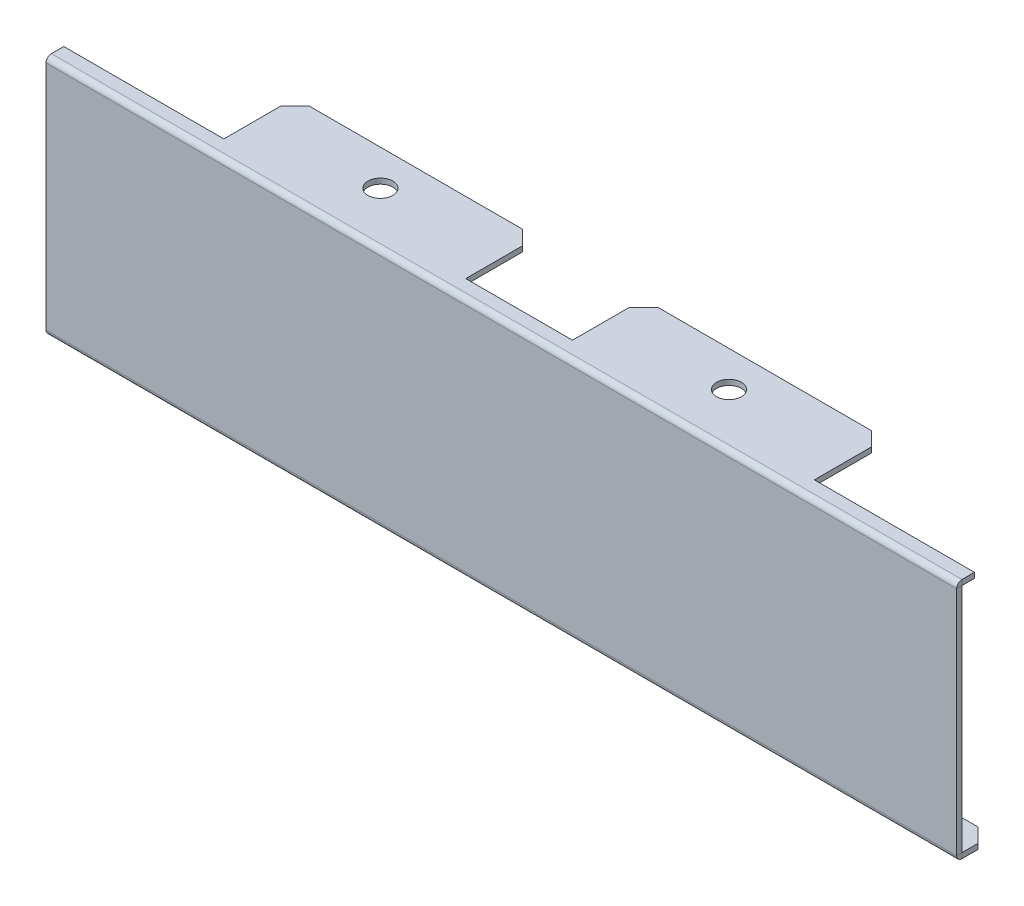
ISO-10303-21;
HEADER;
FILE_DESCRIPTION(('STEP AP214'),'2;1');
FILE_NAME('part.step','',(''),(''),'','','');
FILE_SCHEMA(('AUTOMOTIVE_DESIGN { 1 0 10303 214 1 1 1 1 }'));
ENDSEC;
DATA;
#1=APPLICATION_CONTEXT('core data for automotive mechanical design processes');
#2=APPLICATION_PROTOCOL_DEFINITION('international standard','automotive_design',2000,#1);
#3=PRODUCT_CONTEXT('',#1,'mechanical');
#4=PRODUCT('Part','Part','',(#3));
#5=PRODUCT_RELATED_PRODUCT_CATEGORY('part','',(#4));
#6=PRODUCT_DEFINITION_FORMATION('','',#4);
#7=PRODUCT_DEFINITION_CONTEXT('part definition',#1,'design');
#8=PRODUCT_DEFINITION('design','',#6,#7);
#9=PRODUCT_DEFINITION_SHAPE('','',#8);
#10=(LENGTH_UNIT() NAMED_UNIT(*) SI_UNIT(.MILLI.,.METRE.));
#11=(NAMED_UNIT(*) PLANE_ANGLE_UNIT() SI_UNIT($,.RADIAN.));
#12=(NAMED_UNIT(*) SI_UNIT($,.STERADIAN.) SOLID_ANGLE_UNIT());
#13=UNCERTAINTY_MEASURE_WITH_UNIT(LENGTH_MEASURE(1.E-05),#10,'distance_accuracy_value','');
#14=(GEOMETRIC_REPRESENTATION_CONTEXT(3) GLOBAL_UNCERTAINTY_ASSIGNED_CONTEXT((#13)) GLOBAL_UNIT_ASSIGNED_CONTEXT((#10,
#11,#12)) REPRESENTATION_CONTEXT('',''));
#15=CARTESIAN_POINT('',(0.,0.,0.));
#16=DIRECTION('',(0.,0.,1.));
#17=DIRECTION('',(1.,0.,0.));
#18=AXIS2_PLACEMENT_3D('',#15,#16,#17);
#19=CARTESIAN_POINT('',(0.,0.,-1.5));
#20=DIRECTION('',(0.,0.,1.));
#21=DIRECTION('',(1.,0.,0.));
#22=AXIS2_PLACEMENT_3D('',#19,#20,#21);
#23=PLANE('',#22);
#24=DIRECTION('',(1.,0.,0.));
#25=VECTOR('',#24,1.);
#26=CARTESIAN_POINT('',(-128.,-32.5,-1.5));
#27=LINE('',#26,#25);
#28=CARTESIAN_POINT('',(128.,-32.5,-1.5));
#29=VERTEX_POINT('',#28);
#30=CARTESIAN_POINT('',(-128.,-32.5,-1.5));
#31=VERTEX_POINT('',#30);
#32=EDGE_CURVE('E355',#29,#31,#27,.F.);
#33=ORIENTED_EDGE('',*,*,#32,.T.);
#34=DIRECTION('',(0.,-1.,0.));
#35=VECTOR('',#34,1.);
#36=CARTESIAN_POINT('',(-128.,34.,-1.5));
#37=LINE('',#36,#35);
#38=CARTESIAN_POINT('',(-128.,32.5,-1.5));
#39=VERTEX_POINT('',#38);
#40=EDGE_CURVE('E13',#39,#31,#37,.T.);
#41=ORIENTED_EDGE('',*,*,#40,.F.);
#42=DIRECTION('',(-1.,0.,0.));
#43=VECTOR('',#42,1.);
#44=CARTESIAN_POINT('',(128.,32.5,-1.5));
#45=LINE('',#44,#43);
#46=CARTESIAN_POINT('',(128.,32.5,-1.5));
#47=VERTEX_POINT('',#46);
#48=EDGE_CURVE('E455',#39,#47,#45,.F.);
#49=ORIENTED_EDGE('',*,*,#48,.T.);
#50=DIRECTION('',(0.,1.,0.));
#51=VECTOR('',#50,1.);
#52=CARTESIAN_POINT('',(128.,34.,-1.5));
#53=LINE('',#52,#51);
#54=EDGE_CURVE('E156',#29,#47,#53,.T.);
#55=ORIENTED_EDGE('',*,*,#54,.F.);
#56=EDGE_LOOP('',(#33,#41,#49,#55));
#57=FACE_BOUND('',#56,.T.);
#58=ADVANCED_FACE('F147',(#57),#23,.F.);
#59=CARTESIAN_POINT('',(0.,0.,0.));
#60=DIRECTION('',(0.,0.,1.));
#61=DIRECTION('',(1.,0.,0.));
#62=AXIS2_PLACEMENT_3D('',#59,#60,#61);
#63=PLANE('',#62);
#64=DIRECTION('',(0.,-1.,0.));
#65=VECTOR('',#64,1.);
#66=CARTESIAN_POINT('',(-128.,34.,0.));
#67=LINE('',#66,#65);
#68=CARTESIAN_POINT('',(-128.,32.5,0.));
#69=VERTEX_POINT('',#68);
#70=CARTESIAN_POINT('',(-128.,-32.5,0.));
#71=VERTEX_POINT('',#70);
#72=EDGE_CURVE('E500',#69,#71,#67,.T.);
#73=ORIENTED_EDGE('',*,*,#72,.T.);
#74=DIRECTION('',(-1.,0.,0.));
#75=VECTOR('',#74,1.);
#76=CARTESIAN_POINT('',(0.,-32.5,0.));
#77=LINE('',#76,#75);
#78=CARTESIAN_POINT('',(128.,-32.5,0.));
#79=VERTEX_POINT('',#78);
#80=EDGE_CURVE('E360',#79,#71,#77,.T.);
#81=ORIENTED_EDGE('',*,*,#80,.F.);
#82=DIRECTION('',(0.,1.,0.));
#83=VECTOR('',#82,1.);
#84=CARTESIAN_POINT('',(128.,34.,0.));
#85=LINE('',#84,#83);
#86=CARTESIAN_POINT('',(128.,32.5,0.));
#87=VERTEX_POINT('',#86);
#88=EDGE_CURVE('E171',#79,#87,#85,.T.);
#89=ORIENTED_EDGE('',*,*,#88,.T.);
#90=DIRECTION('',(1.,0.,0.));
#91=VECTOR('',#90,1.);
#92=CARTESIAN_POINT('',(0.,32.5,0.));
#93=LINE('',#92,#91);
#94=EDGE_CURVE('E491',#69,#87,#93,.T.);
#95=ORIENTED_EDGE('',*,*,#94,.F.);
#96=EDGE_LOOP('',(#73,#81,#89,#95));
#97=FACE_BOUND('',#96,.T.);
#98=ADVANCED_FACE('F562',(#97),#63,.T.);
#99=CARTESIAN_POINT('',(-128.,34.,-1.5));
#100=DIRECTION('',(-1.,0.,0.));
#101=DIRECTION('',(0.,0.,1.));
#102=AXIS2_PLACEMENT_3D('',#99,#100,#101);
#103=PLANE('',#102);
#104=ORIENTED_EDGE('',*,*,#40,.T.);
#105=DIRECTION('',(0.,0.,-1.));
#106=VECTOR('',#105,1.);
#107=CARTESIAN_POINT('',(-128.,-32.5,0.));
#108=LINE('',#107,#106);
#109=EDGE_CURVE('E163',#71,#31,#108,.T.);
#110=ORIENTED_EDGE('',*,*,#109,.F.);
#111=ORIENTED_EDGE('',*,*,#72,.F.);
#112=DIRECTION('',(0.,0.,-1.));
#113=VECTOR('',#112,1.);
#114=CARTESIAN_POINT('',(-128.,32.5,0.));
#115=LINE('',#114,#113);
#116=EDGE_CURVE('E494',#69,#39,#115,.T.);
#117=ORIENTED_EDGE('',*,*,#116,.T.);
#118=EDGE_LOOP('',(#104,#110,#111,#117));
#119=FACE_BOUND('',#118,.T.);
#120=ADVANCED_FACE('F567',(#119),#103,.T.);
#121=CARTESIAN_POINT('',(128.,34.,-1.5));
#122=DIRECTION('',(1.,0.,0.));
#123=DIRECTION('',(0.,1.,0.));
#124=AXIS2_PLACEMENT_3D('',#121,#122,#123);
#125=PLANE('',#124);
#126=DIRECTION('',(0.,0.,-1.));
#127=VECTOR('',#126,1.);
#128=CARTESIAN_POINT('',(128.,-32.5,0.));
#129=LINE('',#128,#127);
#130=EDGE_CURVE('E364',#79,#29,#129,.T.);
#131=ORIENTED_EDGE('',*,*,#130,.T.);
#132=ORIENTED_EDGE('',*,*,#54,.T.);
#133=DIRECTION('',(0.,0.,-1.));
#134=VECTOR('',#133,1.);
#135=CARTESIAN_POINT('',(128.,32.5,0.));
#136=LINE('',#135,#134);
#137=EDGE_CURVE('E374',#87,#47,#136,.T.);
#138=ORIENTED_EDGE('',*,*,#137,.F.);
#139=ORIENTED_EDGE('',*,*,#88,.F.);
#140=EDGE_LOOP('',(#131,#132,#138,#139));
#141=FACE_BOUND('',#140,.T.);
#142=ADVANCED_FACE('F149',(#141),#125,.T.);
#143=CARTESIAN_POINT('',(128.,32.5,0.));
#144=DIRECTION('',(1.,0.,0.));
#145=DIRECTION('',(0.,0.,-1.));
#146=AXIS2_PLACEMENT_3D('',#143,#144,#145);
#147=PLANE('',#146);
#148=CARTESIAN_POINT('',(128.,32.5,-1.5));
#149=DIRECTION('',(-1.,0.,0.));
#150=DIRECTION('',(0.,0.,1.));
#151=AXIS2_PLACEMENT_3D('',#148,#149,#150);
#152=CIRCLE('',#151,1.5);
#153=CARTESIAN_POINT('',(128.,34.,-1.49999999999999));
#154=VERTEX_POINT('',#153);
#155=EDGE_CURVE('E498',#87,#154,#152,.T.);
#156=ORIENTED_EDGE('',*,*,#155,.F.);
#157=ORIENTED_EDGE('',*,*,#137,.T.);
#158=DIRECTION('',(0.,-1.,0.));
#159=VECTOR('',#158,1.);
#160=CARTESIAN_POINT('',(128.,34.,-1.49999999999999));
#161=LINE('',#160,#159);
#162=EDGE_CURVE('E417',#154,#47,#161,.T.);
#163=ORIENTED_EDGE('',*,*,#162,.F.);
#164=EDGE_LOOP('',(#156,#157,#163));
#165=FACE_BOUND('',#164,.T.);
#166=ADVANCED_FACE('F570',(#165),#147,.T.);
#167=CARTESIAN_POINT('',(-128.,32.5,-1.5));
#168=DIRECTION('',(-1.,0.,0.));
#169=DIRECTION('',(0.,0.,1.));
#170=AXIS2_PLACEMENT_3D('',#167,#168,#169);
#171=CYLINDRICAL_SURFACE('',#170,1.5);
#172=CARTESIAN_POINT('',(-128.,32.5,-1.5));
#173=DIRECTION('',(-1.,0.,0.));
#174=DIRECTION('',(0.,0.,1.));
#175=AXIS2_PLACEMENT_3D('',#172,#173,#174);
#176=CIRCLE('',#175,1.5);
#177=CARTESIAN_POINT('',(-128.,34.,-1.49999999999999));
#178=VERTEX_POINT('',#177);
#179=EDGE_CURVE('E496',#69,#178,#176,.T.);
#180=ORIENTED_EDGE('',*,*,#179,.F.);
#181=ORIENTED_EDGE('',*,*,#94,.T.);
#182=ORIENTED_EDGE('',*,*,#155,.T.);
#183=DIRECTION('',(1.,0.,0.));
#184=VECTOR('',#183,1.);
#185=CARTESIAN_POINT('',(0.,34.,-1.49999999999999));
#186=LINE('',#185,#184);
#187=EDGE_CURVE('E420',#178,#154,#186,.T.);
#188=ORIENTED_EDGE('',*,*,#187,.F.);
#189=EDGE_LOOP('',(#180,#181,#182,#188));
#190=FACE_BOUND('',#189,.T.);
#191=ADVANCED_FACE('F602',(#190),#171,.T.);
#192=CARTESIAN_POINT('',(-128.,32.5,0.));
#193=DIRECTION('',(1.,0.,0.));
#194=DIRECTION('',(0.,0.,-1.));
#195=AXIS2_PLACEMENT_3D('',#192,#193,#194);
#196=PLANE('',#195);
#197=ORIENTED_EDGE('',*,*,#116,.F.);
#198=ORIENTED_EDGE('',*,*,#179,.T.);
#199=DIRECTION('',(0.,-1.,0.));
#200=VECTOR('',#199,1.);
#201=CARTESIAN_POINT('',(-128.,34.,-1.49999999999999));
#202=LINE('',#201,#200);
#203=EDGE_CURVE('E414',#178,#39,#202,.T.);
#204=ORIENTED_EDGE('',*,*,#203,.T.);
#205=EDGE_LOOP('',(#197,#198,#204));
#206=FACE_BOUND('',#205,.T.);
#207=ADVANCED_FACE('F578',(#206),#196,.F.);
#208=CARTESIAN_POINT('',(128.,34.,-5.));
#209=DIRECTION('',(-1.,0.,0.));
#210=DIRECTION('',(0.,0.,1.));
#211=AXIS2_PLACEMENT_3D('',#208,#209,#210);
#212=PLANE('',#211);
#213=DIRECTION('',(0.,0.,1.));
#214=VECTOR('',#213,1.);
#215=CARTESIAN_POINT('',(128.,32.5,-5.));
#216=LINE('',#215,#214);
#217=CARTESIAN_POINT('',(128.,32.5,-5.));
#218=VERTEX_POINT('',#217);
#219=EDGE_CURVE('E370',#47,#218,#216,.F.);
#220=ORIENTED_EDGE('',*,*,#219,.T.);
#221=DIRECTION('',(0.,-1.,0.));
#222=VECTOR('',#221,1.);
#223=CARTESIAN_POINT('',(128.,34.,-5.));
#224=LINE('',#223,#222);
#225=CARTESIAN_POINT('',(128.,34.,-5.));
#226=VERTEX_POINT('',#225);
#227=EDGE_CURVE('E371',#226,#218,#224,.T.);
#228=ORIENTED_EDGE('',*,*,#227,.F.);
#229=DIRECTION('',(0.,0.,-1.));
#230=VECTOR('',#229,1.);
#231=CARTESIAN_POINT('',(128.,34.,1.40050017855605E-13));
#232=LINE('',#231,#230);
#233=EDGE_CURVE('E452',#154,#226,#232,.T.);
#234=ORIENTED_EDGE('',*,*,#233,.F.);
#235=ORIENTED_EDGE('',*,*,#162,.T.);
#236=EDGE_LOOP('',(#220,#228,#234,#235));
#237=FACE_BOUND('',#236,.T.);
#238=ADVANCED_FACE('F594',(#237),#212,.F.);
#239=CARTESIAN_POINT('',(128.,34.,-5.));
#240=DIRECTION('',(0.,0.,1.));
#241=DIRECTION('',(0.,-1.,0.));
#242=AXIS2_PLACEMENT_3D('',#239,#240,#241);
#243=PLANE('',#242);
#244=DIRECTION('',(1.,0.,0.));
#245=VECTOR('',#244,1.);
#246=CARTESIAN_POINT('',(128.,32.5,-5.));
#247=LINE('',#246,#245);
#248=CARTESIAN_POINT('',(83.,32.5,-4.99999999999998));
#249=VERTEX_POINT('',#248);
#250=EDGE_CURVE('E485',#218,#249,#247,.F.);
#251=ORIENTED_EDGE('',*,*,#250,.T.);
#252=DIRECTION('',(0.,1.,0.));
#253=VECTOR('',#252,1.);
#254=CARTESIAN_POINT('',(83.,34.,-4.99999999999998));
#255=LINE('',#254,#253);
#256=CARTESIAN_POINT('',(83.,34.,-4.99999999999998));
#257=VERTEX_POINT('',#256);
#258=EDGE_CURVE('E375',#257,#249,#255,.F.);
#259=ORIENTED_EDGE('',*,*,#258,.F.);
#260=DIRECTION('',(-1.,0.,0.));
#261=VECTOR('',#260,1.);
#262=CARTESIAN_POINT('',(0.,34.,-4.99999999999994));
#263=LINE('',#262,#261);
#264=EDGE_CURVE('E450',#226,#257,#263,.T.);
#265=ORIENTED_EDGE('',*,*,#264,.F.);
#266=ORIENTED_EDGE('',*,*,#227,.T.);
#267=EDGE_LOOP('',(#251,#259,#265,#266));
#268=FACE_BOUND('',#267,.T.);
#269=ADVANCED_FACE('F668',(#268),#243,.F.);
#270=CARTESIAN_POINT('',(83.,34.0000000000001,-21.));
#271=DIRECTION('',(-1.,0.,0.));
#272=DIRECTION('',(0.,0.,1.));
#273=AXIS2_PLACEMENT_3D('',#270,#271,#272);
#274=PLANE('',#273);
#275=DIRECTION('',(0.,0.,1.));
#276=VECTOR('',#275,1.);
#277=CARTESIAN_POINT('',(83.,32.5000000000001,-21.));
#278=LINE('',#277,#276);
#279=CARTESIAN_POINT('',(83.,32.5000000000001,-21.));
#280=VERTEX_POINT('',#279);
#281=EDGE_CURVE('E483',#249,#280,#278,.F.);
#282=ORIENTED_EDGE('',*,*,#281,.T.);
#283=DIRECTION('',(0.,-1.,0.));
#284=VECTOR('',#283,1.);
#285=CARTESIAN_POINT('',(83.,34.0000000000001,-21.));
#286=LINE('',#285,#284);
#287=CARTESIAN_POINT('',(83.,34.0000000000001,-21.));
#288=VERTEX_POINT('',#287);
#289=EDGE_CURVE('E378',#288,#280,#286,.T.);
#290=ORIENTED_EDGE('',*,*,#289,.F.);
#291=DIRECTION('',(0.,0.,-1.));
#292=VECTOR('',#291,1.);
#293=CARTESIAN_POINT('',(83.,34.,1.40050017855605E-13));
#294=LINE('',#293,#292);
#295=EDGE_CURVE('E448',#257,#288,#294,.T.);
#296=ORIENTED_EDGE('',*,*,#295,.F.);
#297=ORIENTED_EDGE('',*,*,#258,.T.);
#298=EDGE_LOOP('',(#282,#290,#296,#297));
#299=FACE_BOUND('',#298,.T.);
#300=ADVANCED_FACE('F664',(#299),#274,.F.);
#301=CARTESIAN_POINT('',(79.,34.0000000000001,-25.));
#302=DIRECTION('',(-0.707106781186547,0.,0.707106781186548));
#303=DIRECTION('',(0.707106781186548,0.,0.707106781186547));
#304=AXIS2_PLACEMENT_3D('',#301,#302,#303);
#305=PLANE('',#304);
#306=DIRECTION('',(0.707106781186548,0.,0.707106781186547));
#307=VECTOR('',#306,1.);
#308=CARTESIAN_POINT('',(79.,32.5000000000001,-25.));
#309=LINE('',#308,#307);
#310=CARTESIAN_POINT('',(79.,32.5000000000001,-25.));
#311=VERTEX_POINT('',#310);
#312=EDGE_CURVE('E481',#280,#311,#309,.F.);
#313=ORIENTED_EDGE('',*,*,#312,.T.);
#314=DIRECTION('',(0.,-1.,0.));
#315=VECTOR('',#314,1.);
#316=CARTESIAN_POINT('',(79.,34.0000000000001,-25.));
#317=LINE('',#316,#315);
#318=CARTESIAN_POINT('',(79.,34.0000000000001,-25.));
#319=VERTEX_POINT('',#318);
#320=EDGE_CURVE('E381',#319,#311,#317,.T.);
#321=ORIENTED_EDGE('',*,*,#320,.F.);
#322=DIRECTION('',(-0.707106781186548,0.,-0.707106781186547));
#323=VECTOR('',#322,1.);
#324=CARTESIAN_POINT('',(52.,34.0000000000002,-51.9999999999999));
#325=LINE('',#324,#323);
#326=EDGE_CURVE('E446',#288,#319,#325,.T.);
#327=ORIENTED_EDGE('',*,*,#326,.F.);
#328=ORIENTED_EDGE('',*,*,#289,.T.);
#329=EDGE_LOOP('',(#313,#321,#327,#328));
#330=FACE_BOUND('',#329,.T.);
#331=ADVANCED_FACE('F660',(#330),#305,.F.);
#332=CARTESIAN_POINT('',(19.,34.0000000000001,-25.));
#333=DIRECTION('',(0.,0.,1.));
#334=DIRECTION('',(0.,-1.,0.));
#335=AXIS2_PLACEMENT_3D('',#332,#333,#334);
#336=PLANE('',#335);
#337=DIRECTION('',(1.,0.,0.));
#338=VECTOR('',#337,1.);
#339=CARTESIAN_POINT('',(19.,32.5000000000001,-25.));
#340=LINE('',#339,#338);
#341=CARTESIAN_POINT('',(19.,32.5000000000001,-25.));
#342=VERTEX_POINT('',#341);
#343=EDGE_CURVE('E479',#311,#342,#340,.F.);
#344=ORIENTED_EDGE('',*,*,#343,.T.);
#345=DIRECTION('',(0.,-1.,0.));
#346=VECTOR('',#345,1.);
#347=CARTESIAN_POINT('',(19.,34.0000000000001,-25.));
#348=LINE('',#347,#346);
#349=CARTESIAN_POINT('',(19.,34.0000000000001,-25.));
#350=VERTEX_POINT('',#349);
#351=EDGE_CURVE('E384',#350,#342,#348,.T.);
#352=ORIENTED_EDGE('',*,*,#351,.F.);
#353=DIRECTION('',(-1.,0.,0.));
#354=VECTOR('',#353,1.);
#355=CARTESIAN_POINT('',(0.,34.0000000000001,-25.));
#356=LINE('',#355,#354);
#357=EDGE_CURVE('E444',#319,#350,#356,.T.);
#358=ORIENTED_EDGE('',*,*,#357,.F.);
#359=ORIENTED_EDGE('',*,*,#320,.T.);
#360=EDGE_LOOP('',(#344,#352,#358,#359));
#361=FACE_BOUND('',#360,.T.);
#362=ADVANCED_FACE('F656',(#361),#336,.F.);
#363=CARTESIAN_POINT('',(19.,34.0000000000001,-25.));
#364=DIRECTION('',(0.707106781186547,0.,0.707106781186547));
#365=DIRECTION('',(0.707106781186548,0.,-0.707106781186548));
#366=AXIS2_PLACEMENT_3D('',#363,#364,#365);
#367=PLANE('',#366);
#368=DIRECTION('',(0.707106781186548,0.,-0.707106781186548));
#369=VECTOR('',#368,1.);
#370=CARTESIAN_POINT('',(19.,32.5000000000001,-25.));
#371=LINE('',#370,#369);
#372=CARTESIAN_POINT('',(15.,32.5000000000001,-21.));
#373=VERTEX_POINT('',#372);
#374=EDGE_CURVE('E477',#342,#373,#371,.F.);
#375=ORIENTED_EDGE('',*,*,#374,.T.);
#376=DIRECTION('',(0.,-1.,0.));
#377=VECTOR('',#376,1.);
#378=CARTESIAN_POINT('',(15.,34.0000000000001,-21.));
#379=LINE('',#378,#377);
#380=CARTESIAN_POINT('',(15.,34.0000000000001,-21.));
#381=VERTEX_POINT('',#380);
#382=EDGE_CURVE('E387',#381,#373,#379,.T.);
#383=ORIENTED_EDGE('',*,*,#382,.F.);
#384=DIRECTION('',(-0.707106781186548,0.,0.707106781186548));
#385=VECTOR('',#384,1.);
#386=CARTESIAN_POINT('',(-3.00000000000007,34.,-2.99999999999993));
#387=LINE('',#386,#385);
#388=EDGE_CURVE('E442',#350,#381,#387,.T.);
#389=ORIENTED_EDGE('',*,*,#388,.F.);
#390=ORIENTED_EDGE('',*,*,#351,.T.);
#391=EDGE_LOOP('',(#375,#383,#389,#390));
#392=FACE_BOUND('',#391,.T.);
#393=ADVANCED_FACE('F652',(#392),#367,.F.);
#394=CARTESIAN_POINT('',(15.,34.0000000000001,-21.));
#395=DIRECTION('',(1.,0.,0.));
#396=DIRECTION('',(0.,0.,-1.));
#397=AXIS2_PLACEMENT_3D('',#394,#395,#396);
#398=PLANE('',#397);
#399=DIRECTION('',(0.,0.,-1.));
#400=VECTOR('',#399,1.);
#401=CARTESIAN_POINT('',(15.,32.5000000000001,-21.));
#402=LINE('',#401,#400);
#403=CARTESIAN_POINT('',(15.,32.5,-4.99999999999998));
#404=VERTEX_POINT('',#403);
#405=EDGE_CURVE('E475',#373,#404,#402,.F.);
#406=ORIENTED_EDGE('',*,*,#405,.T.);
#407=DIRECTION('',(0.,1.,0.));
#408=VECTOR('',#407,1.);
#409=CARTESIAN_POINT('',(15.,34.,-4.99999999999998));
#410=LINE('',#409,#408);
#411=CARTESIAN_POINT('',(15.,34.,-4.99999999999998));
#412=VERTEX_POINT('',#411);
#413=EDGE_CURVE('E390',#412,#404,#410,.F.);
#414=ORIENTED_EDGE('',*,*,#413,.F.);
#415=DIRECTION('',(0.,0.,1.));
#416=VECTOR('',#415,1.);
#417=CARTESIAN_POINT('',(15.,34.,1.40050017855605E-13));
#418=LINE('',#417,#416);
#419=EDGE_CURVE('E440',#381,#412,#418,.T.);
#420=ORIENTED_EDGE('',*,*,#419,.F.);
#421=ORIENTED_EDGE('',*,*,#382,.T.);
#422=EDGE_LOOP('',(#406,#414,#420,#421));
#423=FACE_BOUND('',#422,.T.);
#424=ADVANCED_FACE('F648',(#423),#398,.F.);
#425=CARTESIAN_POINT('',(-15.,34.,-4.99999999999998));
#426=DIRECTION('',(0.,0.,1.));
#427=DIRECTION('',(0.,-1.,0.));
#428=AXIS2_PLACEMENT_3D('',#425,#426,#427);
#429=PLANE('',#428);
#430=DIRECTION('',(1.,0.,0.));
#431=VECTOR('',#430,1.);
#432=CARTESIAN_POINT('',(-15.,32.5,-4.99999999999998));
#433=LINE('',#432,#431);
#434=CARTESIAN_POINT('',(-15.,32.5,-4.99999999999998));
#435=VERTEX_POINT('',#434);
#436=EDGE_CURVE('E473',#404,#435,#433,.F.);
#437=ORIENTED_EDGE('',*,*,#436,.T.);
#438=DIRECTION('',(0.,1.,0.));
#439=VECTOR('',#438,1.);
#440=CARTESIAN_POINT('',(-15.,34.,-4.99999999999998));
#441=LINE('',#440,#439);
#442=CARTESIAN_POINT('',(-15.,34.,-4.99999999999998));
#443=VERTEX_POINT('',#442);
#444=EDGE_CURVE('E393',#443,#435,#441,.F.);
#445=ORIENTED_EDGE('',*,*,#444,.F.);
#446=DIRECTION('',(-1.,0.,0.));
#447=VECTOR('',#446,1.);
#448=CARTESIAN_POINT('',(0.,34.,-4.99999999999998));
#449=LINE('',#448,#447);
#450=EDGE_CURVE('E438',#412,#443,#449,.T.);
#451=ORIENTED_EDGE('',*,*,#450,.F.);
#452=ORIENTED_EDGE('',*,*,#413,.T.);
#453=EDGE_LOOP('',(#437,#445,#451,#452));
#454=FACE_BOUND('',#453,.T.);
#455=ADVANCED_FACE('F644',(#454),#429,.F.);
#456=CARTESIAN_POINT('',(-15.,34.0000000000001,-21.));
#457=DIRECTION('',(-1.,0.,0.));
#458=DIRECTION('',(0.,0.,1.));
#459=AXIS2_PLACEMENT_3D('',#456,#457,#458);
#460=PLANE('',#459);
#461=DIRECTION('',(0.,0.,1.));
#462=VECTOR('',#461,1.);
#463=CARTESIAN_POINT('',(-15.,32.5000000000001,-21.));
#464=LINE('',#463,#462);
#465=CARTESIAN_POINT('',(-15.,32.5000000000001,-21.));
#466=VERTEX_POINT('',#465);
#467=EDGE_CURVE('E471',#435,#466,#464,.F.);
#468=ORIENTED_EDGE('',*,*,#467,.T.);
#469=DIRECTION('',(0.,-1.,0.));
#470=VECTOR('',#469,1.);
#471=CARTESIAN_POINT('',(-15.,34.0000000000001,-21.));
#472=LINE('',#471,#470);
#473=CARTESIAN_POINT('',(-15.,34.0000000000001,-21.));
#474=VERTEX_POINT('',#473);
#475=EDGE_CURVE('E396',#474,#466,#472,.T.);
#476=ORIENTED_EDGE('',*,*,#475,.F.);
#477=DIRECTION('',(0.,0.,-1.));
#478=VECTOR('',#477,1.);
#479=CARTESIAN_POINT('',(-15.,34.,1.40050017855605E-13));
#480=LINE('',#479,#478);
#481=EDGE_CURVE('E436',#443,#474,#480,.T.);
#482=ORIENTED_EDGE('',*,*,#481,.F.);
#483=ORIENTED_EDGE('',*,*,#444,.T.);
#484=EDGE_LOOP('',(#468,#476,#482,#483));
#485=FACE_BOUND('',#484,.T.);
#486=ADVANCED_FACE('F640',(#485),#460,.F.);
#487=CARTESIAN_POINT('',(-19.,34.0000000000001,-25.));
#488=DIRECTION('',(-0.707106781186547,0.,0.707106781186547));
#489=DIRECTION('',(0.707106781186548,0.,0.707106781186548));
#490=AXIS2_PLACEMENT_3D('',#487,#488,#489);
#491=PLANE('',#490);
#492=DIRECTION('',(0.707106781186548,0.,0.707106781186548));
#493=VECTOR('',#492,1.);
#494=CARTESIAN_POINT('',(-19.,32.5000000000001,-25.));
#495=LINE('',#494,#493);
#496=CARTESIAN_POINT('',(-19.,32.5000000000001,-25.));
#497=VERTEX_POINT('',#496);
#498=EDGE_CURVE('E469',#466,#497,#495,.F.);
#499=ORIENTED_EDGE('',*,*,#498,.T.);
#500=DIRECTION('',(0.,-1.,0.));
#501=VECTOR('',#500,1.);
#502=CARTESIAN_POINT('',(-19.,34.0000000000001,-25.));
#503=LINE('',#502,#501);
#504=CARTESIAN_POINT('',(-19.,34.0000000000001,-25.));
#505=VERTEX_POINT('',#504);
#506=EDGE_CURVE('E399',#505,#497,#503,.T.);
#507=ORIENTED_EDGE('',*,*,#506,.F.);
#508=DIRECTION('',(-0.707106781186548,0.,-0.707106781186548));
#509=VECTOR('',#508,1.);
#510=CARTESIAN_POINT('',(3.00000000000007,34.,-2.99999999999993));
#511=LINE('',#510,#509);
#512=EDGE_CURVE('E434',#474,#505,#511,.T.);
#513=ORIENTED_EDGE('',*,*,#512,.F.);
#514=ORIENTED_EDGE('',*,*,#475,.T.);
#515=EDGE_LOOP('',(#499,#507,#513,#514));
#516=FACE_BOUND('',#515,.T.);
#517=ADVANCED_FACE('F636',(#516),#491,.F.);
#518=CARTESIAN_POINT('',(-79.,34.0000000000001,-25.));
#519=DIRECTION('',(0.,0.,1.));
#520=DIRECTION('',(0.,-1.,0.));
#521=AXIS2_PLACEMENT_3D('',#518,#519,#520);
#522=PLANE('',#521);
#523=DIRECTION('',(1.,0.,0.));
#524=VECTOR('',#523,1.);
#525=CARTESIAN_POINT('',(-79.,32.5000000000001,-25.));
#526=LINE('',#525,#524);
#527=CARTESIAN_POINT('',(-79.,32.5000000000001,-25.));
#528=VERTEX_POINT('',#527);
#529=EDGE_CURVE('E467',#497,#528,#526,.F.);
#530=ORIENTED_EDGE('',*,*,#529,.T.);
#531=DIRECTION('',(0.,-1.,0.));
#532=VECTOR('',#531,1.);
#533=CARTESIAN_POINT('',(-79.,34.0000000000001,-25.));
#534=LINE('',#533,#532);
#535=CARTESIAN_POINT('',(-79.,34.0000000000001,-25.));
#536=VERTEX_POINT('',#535);
#537=EDGE_CURVE('E402',#536,#528,#534,.T.);
#538=ORIENTED_EDGE('',*,*,#537,.F.);
#539=DIRECTION('',(-1.,0.,0.));
#540=VECTOR('',#539,1.);
#541=CARTESIAN_POINT('',(0.,34.0000000000001,-25.));
#542=LINE('',#541,#540);
#543=EDGE_CURVE('E432',#505,#536,#542,.T.);
#544=ORIENTED_EDGE('',*,*,#543,.F.);
#545=ORIENTED_EDGE('',*,*,#506,.T.);
#546=EDGE_LOOP('',(#530,#538,#544,#545));
#547=FACE_BOUND('',#546,.T.);
#548=ADVANCED_FACE('F632',(#547),#522,.F.);
#549=CARTESIAN_POINT('',(-79.,34.0000000000001,-25.));
#550=DIRECTION('',(0.707106781186547,0.,0.707106781186548));
#551=DIRECTION('',(0.707106781186548,0.,-0.707106781186547));
#552=AXIS2_PLACEMENT_3D('',#549,#550,#551);
#553=PLANE('',#552);
#554=DIRECTION('',(0.707106781186548,0.,-0.707106781186547));
#555=VECTOR('',#554,1.);
#556=CARTESIAN_POINT('',(-79.,32.5000000000001,-25.));
#557=LINE('',#556,#555);
#558=CARTESIAN_POINT('',(-83.,32.5000000000001,-21.));
#559=VERTEX_POINT('',#558);
#560=EDGE_CURVE('E465',#528,#559,#557,.F.);
#561=ORIENTED_EDGE('',*,*,#560,.T.);
#562=DIRECTION('',(0.,-1.,0.));
#563=VECTOR('',#562,1.);
#564=CARTESIAN_POINT('',(-83.,34.0000000000001,-21.));
#565=LINE('',#564,#563);
#566=CARTESIAN_POINT('',(-83.,34.0000000000001,-21.));
#567=VERTEX_POINT('',#566);
#568=EDGE_CURVE('E405',#567,#559,#565,.T.);
#569=ORIENTED_EDGE('',*,*,#568,.F.);
#570=DIRECTION('',(-0.707106781186548,0.,0.707106781186547));
#571=VECTOR('',#570,1.);
#572=CARTESIAN_POINT('',(-52.,34.0000000000002,-51.9999999999999));
#573=LINE('',#572,#571);
#574=EDGE_CURVE('E430',#536,#567,#573,.T.);
#575=ORIENTED_EDGE('',*,*,#574,.F.);
#576=ORIENTED_EDGE('',*,*,#537,.T.);
#577=EDGE_LOOP('',(#561,#569,#575,#576));
#578=FACE_BOUND('',#577,.T.);
#579=ADVANCED_FACE('F628',(#578),#553,.F.);
#580=CARTESIAN_POINT('',(-83.,34.0000000000001,-21.));
#581=DIRECTION('',(1.,0.,0.));
#582=DIRECTION('',(0.,0.,-1.));
#583=AXIS2_PLACEMENT_3D('',#580,#581,#582);
#584=PLANE('',#583);
#585=DIRECTION('',(0.,0.,-1.));
#586=VECTOR('',#585,1.);
#587=CARTESIAN_POINT('',(-83.,32.5000000000001,-21.));
#588=LINE('',#587,#586);
#589=CARTESIAN_POINT('',(-83.,32.5,-4.99999999999998));
#590=VERTEX_POINT('',#589);
#591=EDGE_CURVE('E463',#559,#590,#588,.F.);
#592=ORIENTED_EDGE('',*,*,#591,.T.);
#593=DIRECTION('',(0.,1.,0.));
#594=VECTOR('',#593,1.);
#595=CARTESIAN_POINT('',(-83.,34.,-4.99999999999998));
#596=LINE('',#595,#594);
#597=CARTESIAN_POINT('',(-83.,34.,-4.99999999999998));
#598=VERTEX_POINT('',#597);
#599=EDGE_CURVE('E408',#598,#590,#596,.F.);
#600=ORIENTED_EDGE('',*,*,#599,.F.);
#601=DIRECTION('',(0.,0.,1.));
#602=VECTOR('',#601,1.);
#603=CARTESIAN_POINT('',(-83.,34.,1.40050017855605E-13));
#604=LINE('',#603,#602);
#605=EDGE_CURVE('E428',#567,#598,#604,.T.);
#606=ORIENTED_EDGE('',*,*,#605,.F.);
#607=ORIENTED_EDGE('',*,*,#568,.T.);
#608=EDGE_LOOP('',(#592,#600,#606,#607));
#609=FACE_BOUND('',#608,.T.);
#610=ADVANCED_FACE('F624',(#609),#584,.F.);
#611=CARTESIAN_POINT('',(-128.,34.,-4.99999999999998));
#612=DIRECTION('',(0.,0.,1.));
#613=DIRECTION('',(0.,-1.,0.));
#614=AXIS2_PLACEMENT_3D('',#611,#612,#613);
#615=PLANE('',#614);
#616=DIRECTION('',(1.,0.,0.));
#617=VECTOR('',#616,1.);
#618=CARTESIAN_POINT('',(-128.,32.5,-4.99999999999998));
#619=LINE('',#618,#617);
#620=CARTESIAN_POINT('',(-128.,32.5,-4.99999999999998));
#621=VERTEX_POINT('',#620);
#622=EDGE_CURVE('E461',#590,#621,#619,.F.);
#623=ORIENTED_EDGE('',*,*,#622,.T.);
#624=DIRECTION('',(0.,-1.,0.));
#625=VECTOR('',#624,1.);
#626=CARTESIAN_POINT('',(-128.,34.,-4.99999999999998));
#627=LINE('',#626,#625);
#628=CARTESIAN_POINT('',(-128.,34.,-4.99999999999998));
#629=VERTEX_POINT('',#628);
#630=EDGE_CURVE('E411',#629,#621,#627,.T.);
#631=ORIENTED_EDGE('',*,*,#630,.F.);
#632=DIRECTION('',(-1.,0.,0.));
#633=VECTOR('',#632,1.);
#634=CARTESIAN_POINT('',(0.,34.,-4.99999999999998));
#635=LINE('',#634,#633);
#636=EDGE_CURVE('E426',#598,#629,#635,.T.);
#637=ORIENTED_EDGE('',*,*,#636,.F.);
#638=ORIENTED_EDGE('',*,*,#599,.T.);
#639=EDGE_LOOP('',(#623,#631,#637,#638));
#640=FACE_BOUND('',#639,.T.);
#641=ADVANCED_FACE('F621',(#640),#615,.F.);
#642=CARTESIAN_POINT('',(-128.,34.,-1.49999999999999));
#643=DIRECTION('',(1.,0.,0.));
#644=DIRECTION('',(0.,0.,-1.));
#645=AXIS2_PLACEMENT_3D('',#642,#643,#644);
#646=PLANE('',#645);
#647=DIRECTION('',(0.,0.,-1.));
#648=VECTOR('',#647,1.);
#649=CARTESIAN_POINT('',(-128.,32.5,-1.5));
#650=LINE('',#649,#648);
#651=EDGE_CURVE('E458',#621,#39,#650,.F.);
#652=ORIENTED_EDGE('',*,*,#651,.T.);
#653=ORIENTED_EDGE('',*,*,#203,.F.);
#654=DIRECTION('',(0.,0.,1.));
#655=VECTOR('',#654,1.);
#656=CARTESIAN_POINT('',(-128.,34.,1.40050017855605E-13));
#657=LINE('',#656,#655);
#658=EDGE_CURVE('E423',#629,#178,#657,.T.);
#659=ORIENTED_EDGE('',*,*,#658,.F.);
#660=ORIENTED_EDGE('',*,*,#630,.T.);
#661=EDGE_LOOP('',(#652,#653,#659,#660));
#662=FACE_BOUND('',#661,.T.);
#663=ADVANCED_FACE('F585',(#662),#646,.F.);
#664=CARTESIAN_POINT('',(0.,34.,1.40050017855605E-13));
#665=DIRECTION('',(0.,-1.,0.));
#666=DIRECTION('',(0.,0.,-1.));
#667=AXIS2_PLACEMENT_3D('',#664,#665,#666);
#668=PLANE('',#667);
#669=CARTESIAN_POINT('',(49.,34.,-15.));
#670=DIRECTION('',(0.,1.,0.));
#671=DIRECTION('',(0.,0.,1.));
#672=AXIS2_PLACEMENT_3D('',#669,#670,#671);
#673=CIRCLE('',#672,3.5);
#674=CARTESIAN_POINT('',(49.,34.,-11.5));
#675=VERTEX_POINT('',#674);
#676=EDGE_CURVE('E512',#675,#675,#673,.T.);
#677=ORIENTED_EDGE('',*,*,#676,.F.);
#678=EDGE_LOOP('',(#677));
#679=FACE_BOUND('',#678,.T.);
#680=CARTESIAN_POINT('',(-49.,34.,-15.));
#681=DIRECTION('',(0.,1.,0.));
#682=DIRECTION('',(0.,0.,1.));
#683=AXIS2_PLACEMENT_3D('',#680,#681,#682);
#684=CIRCLE('',#683,3.5);
#685=CARTESIAN_POINT('',(-49.,34.,-11.5));
#686=VERTEX_POINT('',#685);
#687=EDGE_CURVE('E504',#686,#686,#684,.T.);
#688=ORIENTED_EDGE('',*,*,#687,.F.);
#689=EDGE_LOOP('',(#688));
#690=FACE_BOUND('',#689,.T.);
#691=ORIENTED_EDGE('',*,*,#233,.T.);
#692=ORIENTED_EDGE('',*,*,#264,.T.);
#693=ORIENTED_EDGE('',*,*,#295,.T.);
#694=ORIENTED_EDGE('',*,*,#326,.T.);
#695=ORIENTED_EDGE('',*,*,#357,.T.);
#696=ORIENTED_EDGE('',*,*,#388,.T.);
#697=ORIENTED_EDGE('',*,*,#419,.T.);
#698=ORIENTED_EDGE('',*,*,#450,.T.);
#699=ORIENTED_EDGE('',*,*,#481,.T.);
#700=ORIENTED_EDGE('',*,*,#512,.T.);
#701=ORIENTED_EDGE('',*,*,#543,.T.);
#702=ORIENTED_EDGE('',*,*,#574,.T.);
#703=ORIENTED_EDGE('',*,*,#605,.T.);
#704=ORIENTED_EDGE('',*,*,#636,.T.);
#705=ORIENTED_EDGE('',*,*,#658,.T.);
#706=ORIENTED_EDGE('',*,*,#187,.T.);
#707=EDGE_LOOP('',(#691,#692,#693,#694,#695,#696,#697,#698,#699,#700,#701,#702,#703,#704,#705,#706));
#708=FACE_BOUND('',#707,.T.);
#709=ADVANCED_FACE('F600',(#679,#690,#708),#668,.F.);
#710=CARTESIAN_POINT('',(0.,32.5,1.3481279584734E-13));
#711=DIRECTION('',(0.,-1.,0.));
#712=DIRECTION('',(0.,0.,-1.));
#713=AXIS2_PLACEMENT_3D('',#710,#711,#712);
#714=PLANE('',#713);
#715=CARTESIAN_POINT('',(49.,32.5,-15.));
#716=DIRECTION('',(0.,-1.,0.));
#717=DIRECTION('',(0.,0.,-1.));
#718=AXIS2_PLACEMENT_3D('',#715,#716,#717);
#719=CIRCLE('',#718,3.5);
#720=CARTESIAN_POINT('',(49.,32.5000000000001,-18.5));
#721=VERTEX_POINT('',#720);
#722=EDGE_CURVE('E151',#721,#721,#719,.T.);
#723=ORIENTED_EDGE('',*,*,#722,.F.);
#724=EDGE_LOOP('',(#723));
#725=FACE_BOUND('',#724,.T.);
#726=CARTESIAN_POINT('',(-49.,32.5,-15.));
#727=DIRECTION('',(0.,-1.,0.));
#728=DIRECTION('',(0.,0.,-1.));
#729=AXIS2_PLACEMENT_3D('',#726,#727,#728);
#730=CIRCLE('',#729,3.5);
#731=CARTESIAN_POINT('',(-49.,32.5000000000001,-18.5));
#732=VERTEX_POINT('',#731);
#733=EDGE_CURVE('E358',#732,#732,#730,.T.);
#734=ORIENTED_EDGE('',*,*,#733,.F.);
#735=EDGE_LOOP('',(#734));
#736=FACE_BOUND('',#735,.T.);
#737=ORIENTED_EDGE('',*,*,#219,.F.);
#738=ORIENTED_EDGE('',*,*,#48,.F.);
#739=ORIENTED_EDGE('',*,*,#651,.F.);
#740=ORIENTED_EDGE('',*,*,#622,.F.);
#741=ORIENTED_EDGE('',*,*,#591,.F.);
#742=ORIENTED_EDGE('',*,*,#560,.F.);
#743=ORIENTED_EDGE('',*,*,#529,.F.);
#744=ORIENTED_EDGE('',*,*,#498,.F.);
#745=ORIENTED_EDGE('',*,*,#467,.F.);
#746=ORIENTED_EDGE('',*,*,#436,.F.);
#747=ORIENTED_EDGE('',*,*,#405,.F.);
#748=ORIENTED_EDGE('',*,*,#374,.F.);
#749=ORIENTED_EDGE('',*,*,#343,.F.);
#750=ORIENTED_EDGE('',*,*,#312,.F.);
#751=ORIENTED_EDGE('',*,*,#281,.F.);
#752=ORIENTED_EDGE('',*,*,#250,.F.);
#753=EDGE_LOOP('',(#737,#738,#739,#740,#741,#742,#743,#744,#745,#746,#747,#748,#749,#750,#751,#752));
#754=FACE_BOUND('',#753,.T.);
#755=ADVANCED_FACE('F590',(#725,#736,#754),#714,.T.);
#756=CARTESIAN_POINT('',(-128.,-32.5,0.));
#757=DIRECTION('',(-1.,0.,0.));
#758=DIRECTION('',(0.,0.,1.));
#759=AXIS2_PLACEMENT_3D('',#756,#757,#758);
#760=PLANE('',#759);
#761=CARTESIAN_POINT('',(-128.,-32.5,-1.5));
#762=DIRECTION('',(1.,0.,0.));
#763=DIRECTION('',(0.,0.,-1.));
#764=AXIS2_PLACEMENT_3D('',#761,#762,#763);
#765=CIRCLE('',#764,1.5);
#766=CARTESIAN_POINT('',(-128.,-34.,-1.49999999999999));
#767=VERTEX_POINT('',#766);
#768=EDGE_CURVE('E368',#71,#767,#765,.T.);
#769=ORIENTED_EDGE('',*,*,#768,.F.);
#770=ORIENTED_EDGE('',*,*,#109,.T.);
#771=DIRECTION('',(0.,1.,0.));
#772=VECTOR('',#771,1.);
#773=CARTESIAN_POINT('',(-128.,-34.,-1.49999999999999));
#774=LINE('',#773,#772);
#775=EDGE_CURVE('E361',#767,#31,#774,.T.);
#776=ORIENTED_EDGE('',*,*,#775,.F.);
#777=EDGE_LOOP('',(#769,#770,#776));
#778=FACE_BOUND('',#777,.T.);
#779=ADVANCED_FACE('F604',(#778),#760,.T.);
#780=CARTESIAN_POINT('',(128.,-32.5,-1.5));
#781=DIRECTION('',(1.,0.,0.));
#782=DIRECTION('',(0.,0.,-1.));
#783=AXIS2_PLACEMENT_3D('',#780,#781,#782);
#784=CYLINDRICAL_SURFACE('',#783,1.5);
#785=CARTESIAN_POINT('',(128.,-32.5,-1.5));
#786=DIRECTION('',(1.,0.,0.));
#787=DIRECTION('',(0.,0.,-1.));
#788=AXIS2_PLACEMENT_3D('',#785,#786,#787);
#789=CIRCLE('',#788,1.5);
#790=CARTESIAN_POINT('',(128.,-34.,-1.49999999999999));
#791=VERTEX_POINT('',#790);
#792=EDGE_CURVE('E366',#79,#791,#789,.T.);
#793=ORIENTED_EDGE('',*,*,#792,.F.);
#794=ORIENTED_EDGE('',*,*,#80,.T.);
#795=ORIENTED_EDGE('',*,*,#768,.T.);
#796=DIRECTION('',(-1.,0.,0.));
#797=VECTOR('',#796,1.);
#798=CARTESIAN_POINT('',(0.,-34.,-1.49999999999999));
#799=LINE('',#798,#797);
#800=EDGE_CURVE('E344',#791,#767,#799,.T.);
#801=ORIENTED_EDGE('',*,*,#800,.F.);
#802=EDGE_LOOP('',(#793,#794,#795,#801));
#803=FACE_BOUND('',#802,.T.);
#804=ADVANCED_FACE('F541',(#803),#784,.T.);
#805=CARTESIAN_POINT('',(128.,-32.5,0.));
#806=DIRECTION('',(-1.,0.,0.));
#807=DIRECTION('',(0.,0.,1.));
#808=AXIS2_PLACEMENT_3D('',#805,#806,#807);
#809=PLANE('',#808);
#810=ORIENTED_EDGE('',*,*,#130,.F.);
#811=ORIENTED_EDGE('',*,*,#792,.T.);
#812=DIRECTION('',(0.,1.,0.));
#813=VECTOR('',#812,1.);
#814=CARTESIAN_POINT('',(128.,-34.,-1.49999999999999));
#815=LINE('',#814,#813);
#816=EDGE_CURVE('E332',#791,#29,#815,.T.);
#817=ORIENTED_EDGE('',*,*,#816,.T.);
#818=EDGE_LOOP('',(#810,#811,#817));
#819=FACE_BOUND('',#818,.T.);
#820=ADVANCED_FACE('F537',(#819),#809,.F.);
#821=CARTESIAN_POINT('',(-128.,-34.,-6.));
#822=DIRECTION('',(1.,0.,0.));
#823=DIRECTION('',(0.,0.,-1.));
#824=AXIS2_PLACEMENT_3D('',#821,#822,#823);
#825=PLANE('',#824);
#826=DIRECTION('',(0.,0.,1.));
#827=VECTOR('',#826,1.);
#828=CARTESIAN_POINT('',(-128.,-32.5,-6.));
#829=LINE('',#828,#827);
#830=CARTESIAN_POINT('',(-128.,-32.5,-6.00000000000001));
#831=VERTEX_POINT('',#830);
#832=EDGE_CURVE('E353',#31,#831,#829,.F.);
#833=ORIENTED_EDGE('',*,*,#832,.T.);
#834=DIRECTION('',(0.,1.,0.));
#835=VECTOR('',#834,1.);
#836=CARTESIAN_POINT('',(-128.,-34.,-6.));
#837=LINE('',#836,#835);
#838=CARTESIAN_POINT('',(-128.,-34.,-6.));
#839=VERTEX_POINT('',#838);
#840=EDGE_CURVE('E517',#839,#831,#837,.T.);
#841=ORIENTED_EDGE('',*,*,#840,.F.);
#842=DIRECTION('',(0.,0.,-1.));
#843=VECTOR('',#842,1.);
#844=CARTESIAN_POINT('',(-128.,-34.,-6.79400309843914E-13));
#845=LINE('',#844,#843);
#846=EDGE_CURVE('E342',#767,#839,#845,.T.);
#847=ORIENTED_EDGE('',*,*,#846,.F.);
#848=ORIENTED_EDGE('',*,*,#775,.T.);
#849=EDGE_LOOP('',(#833,#841,#847,#848));
#850=FACE_BOUND('',#849,.T.);
#851=ADVANCED_FACE('F549',(#850),#825,.F.);
#852=CARTESIAN_POINT('',(-124.,-34.,-10.));
#853=DIRECTION('',(0.707106781186547,0.,0.707106781186548));
#854=DIRECTION('',(0.707106781186548,0.,-0.707106781186547));
#855=AXIS2_PLACEMENT_3D('',#852,#853,#854);
#856=PLANE('',#855);
#857=DIRECTION('',(-0.707106781186548,0.,0.707106781186547));
#858=VECTOR('',#857,1.);
#859=CARTESIAN_POINT('',(-124.,-32.5,-10.));
#860=LINE('',#859,#858);
#861=CARTESIAN_POINT('',(-124.,-32.5,-10.));
#862=VERTEX_POINT('',#861);
#863=EDGE_CURVE('E351',#831,#862,#860,.F.);
#864=ORIENTED_EDGE('',*,*,#863,.T.);
#865=DIRECTION('',(0.,1.,0.));
#866=VECTOR('',#865,1.);
#867=CARTESIAN_POINT('',(-124.,-34.,-10.));
#868=LINE('',#867,#866);
#869=CARTESIAN_POINT('',(-124.,-34.,-10.));
#870=VERTEX_POINT('',#869);
#871=EDGE_CURVE('E520',#870,#862,#868,.T.);
#872=ORIENTED_EDGE('',*,*,#871,.F.);
#873=DIRECTION('',(0.707106781186548,0.,-0.707106781186547));
#874=VECTOR('',#873,1.);
#875=CARTESIAN_POINT('',(-67.,-34.0000000000002,-66.9999999999999));
#876=LINE('',#875,#874);
#877=EDGE_CURVE('E340',#839,#870,#876,.T.);
#878=ORIENTED_EDGE('',*,*,#877,.F.);
#879=ORIENTED_EDGE('',*,*,#840,.T.);
#880=EDGE_LOOP('',(#864,#872,#878,#879));
#881=FACE_BOUND('',#880,.T.);
#882=ADVANCED_FACE('F551',(#881),#856,.F.);
#883=CARTESIAN_POINT('',(124.,-34.,-10.));
#884=DIRECTION('',(0.,0.,1.));
#885=DIRECTION('',(0.,-1.,0.));
#886=AXIS2_PLACEMENT_3D('',#883,#884,#885);
#887=PLANE('',#886);
#888=DIRECTION('',(-1.,0.,0.));
#889=VECTOR('',#888,1.);
#890=CARTESIAN_POINT('',(124.,-32.5,-10.));
#891=LINE('',#890,#889);
#892=CARTESIAN_POINT('',(124.,-32.5,-10.));
#893=VERTEX_POINT('',#892);
#894=EDGE_CURVE('E349',#862,#893,#891,.F.);
#895=ORIENTED_EDGE('',*,*,#894,.T.);
#896=DIRECTION('',(0.,1.,0.));
#897=VECTOR('',#896,1.);
#898=CARTESIAN_POINT('',(124.,-34.,-10.));
#899=LINE('',#898,#897);
#900=CARTESIAN_POINT('',(124.,-34.,-10.));
#901=VERTEX_POINT('',#900);
#902=EDGE_CURVE('E331',#901,#893,#899,.T.);
#903=ORIENTED_EDGE('',*,*,#902,.F.);
#904=DIRECTION('',(1.,0.,0.));
#905=VECTOR('',#904,1.);
#906=CARTESIAN_POINT('',(0.,-34.,-10.));
#907=LINE('',#906,#905);
#908=EDGE_CURVE('E318',#870,#901,#907,.T.);
#909=ORIENTED_EDGE('',*,*,#908,.F.);
#910=ORIENTED_EDGE('',*,*,#871,.T.);
#911=EDGE_LOOP('',(#895,#903,#909,#910));
#912=FACE_BOUND('',#911,.T.);
#913=ADVANCED_FACE('F552',(#912),#887,.F.);
#914=CARTESIAN_POINT('',(128.,-34.,-6.));
#915=DIRECTION('',(-0.707106781186547,0.,0.707106781186548));
#916=DIRECTION('',(0.707106781186548,0.,0.707106781186547));
#917=AXIS2_PLACEMENT_3D('',#914,#915,#916);
#918=PLANE('',#917);
#919=DIRECTION('',(-0.707106781186548,0.,-0.707106781186547));
#920=VECTOR('',#919,1.);
#921=CARTESIAN_POINT('',(128.,-32.5,-6.00000000000001));
#922=LINE('',#921,#920);
#923=CARTESIAN_POINT('',(128.,-32.5,-6.00000000000001));
#924=VERTEX_POINT('',#923);
#925=EDGE_CURVE('E327',#893,#924,#922,.F.);
#926=ORIENTED_EDGE('',*,*,#925,.T.);
#927=DIRECTION('',(0.,1.,0.));
#928=VECTOR('',#927,1.);
#929=CARTESIAN_POINT('',(128.,-34.,-6.));
#930=LINE('',#929,#928);
#931=CARTESIAN_POINT('',(128.,-34.,-5.99999999999999));
#932=VERTEX_POINT('',#931);
#933=EDGE_CURVE('E324',#932,#924,#930,.T.);
#934=ORIENTED_EDGE('',*,*,#933,.F.);
#935=DIRECTION('',(0.707106781186548,0.,0.707106781186547));
#936=VECTOR('',#935,1.);
#937=CARTESIAN_POINT('',(67.,-34.0000000000002,-67.));
#938=LINE('',#937,#936);
#939=EDGE_CURVE('E310',#901,#932,#938,.T.);
#940=ORIENTED_EDGE('',*,*,#939,.F.);
#941=ORIENTED_EDGE('',*,*,#902,.T.);
#942=EDGE_LOOP('',(#926,#934,#940,#941));
#943=FACE_BOUND('',#942,.T.);
#944=ADVANCED_FACE('F325',(#943),#918,.F.);
#945=CARTESIAN_POINT('',(128.,-34.,-1.49999999999999));
#946=DIRECTION('',(-1.,0.,0.));
#947=DIRECTION('',(0.,0.,1.));
#948=AXIS2_PLACEMENT_3D('',#945,#946,#947);
#949=PLANE('',#948);
#950=DIRECTION('',(0.,0.,-1.));
#951=VECTOR('',#950,1.);
#952=CARTESIAN_POINT('',(128.,-32.5,-1.5));
#953=LINE('',#952,#951);
#954=EDGE_CURVE('E346',#924,#29,#953,.F.);
#955=ORIENTED_EDGE('',*,*,#954,.T.);
#956=ORIENTED_EDGE('',*,*,#816,.F.);
#957=DIRECTION('',(0.,0.,1.));
#958=VECTOR('',#957,1.);
#959=CARTESIAN_POINT('',(128.,-34.,1.10091618778418E-13));
#960=LINE('',#959,#958);
#961=EDGE_CURVE('E315',#932,#791,#960,.T.);
#962=ORIENTED_EDGE('',*,*,#961,.F.);
#963=ORIENTED_EDGE('',*,*,#933,.T.);
#964=EDGE_LOOP('',(#955,#956,#962,#963));
#965=FACE_BOUND('',#964,.T.);
#966=ADVANCED_FACE('F334',(#965),#949,.F.);
#967=CARTESIAN_POINT('',(0.,-34.,1.10091618778418E-13));
#968=DIRECTION('',(0.,1.,0.));
#969=DIRECTION('',(0.,0.,1.));
#970=AXIS2_PLACEMENT_3D('',#967,#968,#969);
#971=PLANE('',#970);
#972=ORIENTED_EDGE('',*,*,#800,.T.);
#973=ORIENTED_EDGE('',*,*,#846,.T.);
#974=ORIENTED_EDGE('',*,*,#877,.T.);
#975=ORIENTED_EDGE('',*,*,#908,.T.);
#976=ORIENTED_EDGE('',*,*,#939,.T.);
#977=ORIENTED_EDGE('',*,*,#961,.T.);
#978=EDGE_LOOP('',(#972,#973,#974,#975,#976,#977));
#979=FACE_BOUND('',#978,.T.);
#980=ADVANCED_FACE('F313',(#979),#971,.F.);
#981=CARTESIAN_POINT('',(0.,-32.5,1.04854396770154E-13));
#982=DIRECTION('',(0.,1.,0.));
#983=DIRECTION('',(0.,0.,1.));
#984=AXIS2_PLACEMENT_3D('',#981,#982,#983);
#985=PLANE('',#984);
#986=ORIENTED_EDGE('',*,*,#32,.F.);
#987=ORIENTED_EDGE('',*,*,#954,.F.);
#988=ORIENTED_EDGE('',*,*,#925,.F.);
#989=ORIENTED_EDGE('',*,*,#894,.F.);
#990=ORIENTED_EDGE('',*,*,#863,.F.);
#991=ORIENTED_EDGE('',*,*,#832,.F.);
#992=EDGE_LOOP('',(#986,#987,#988,#989,#990,#991));
#993=FACE_BOUND('',#992,.T.);
#994=ADVANCED_FACE('F527',(#993),#985,.T.);
#995=CARTESIAN_POINT('',(-49.,-34.0000000000001,-15.0000000000003));
#996=DIRECTION('',(0.,1.,0.));
#997=DIRECTION('',(0.,0.,1.));
#998=AXIS2_PLACEMENT_3D('',#995,#996,#997);
#999=CYLINDRICAL_SURFACE('',#998,3.5);
#1000=ORIENTED_EDGE('',*,*,#733,.T.);
#1001=EDGE_LOOP('',(#1000));
#1002=FACE_BOUND('',#1001,.T.);
#1003=ORIENTED_EDGE('',*,*,#687,.T.);
#1004=EDGE_LOOP('',(#1003));
#1005=FACE_BOUND('',#1004,.T.);
#1006=ADVANCED_FACE('F766',(#1002,#1005),#999,.F.);
#1007=CARTESIAN_POINT('',(49.,-34.0000000000001,-15.0000000000003));
#1008=DIRECTION('',(0.,1.,0.));
#1009=DIRECTION('',(0.,0.,1.));
#1010=AXIS2_PLACEMENT_3D('',#1007,#1008,#1009);
#1011=CYLINDRICAL_SURFACE('',#1010,3.5);
#1012=ORIENTED_EDGE('',*,*,#722,.T.);
#1013=EDGE_LOOP('',(#1012));
#1014=FACE_BOUND('',#1013,.T.);
#1015=ORIENTED_EDGE('',*,*,#676,.T.);
#1016=EDGE_LOOP('',(#1015));
#1017=FACE_BOUND('',#1016,.T.);
#1018=ADVANCED_FACE('F792',(#1014,#1017),#1011,.F.);
#1019=CLOSED_SHELL('',(#58,#98,#120,#142,#166,#191,#207,#238,#269,#300,#331,#362,#393,#424,#455,
#486,#517,#548,#579,#610,#641,#663,#709,#755,#779,#804,#820,#851,#882,#913,#944,#966,#980,#994,
#1006,#1018));
#1020=MANIFOLD_SOLID_BREP('B2',#1019);
#1021=ADVANCED_BREP_SHAPE_REPRESENTATION('',(#18,#1020),#14);
#1022=SHAPE_DEFINITION_REPRESENTATION(#9,#1021);
ENDSEC;
END-ISO-10303-21;
